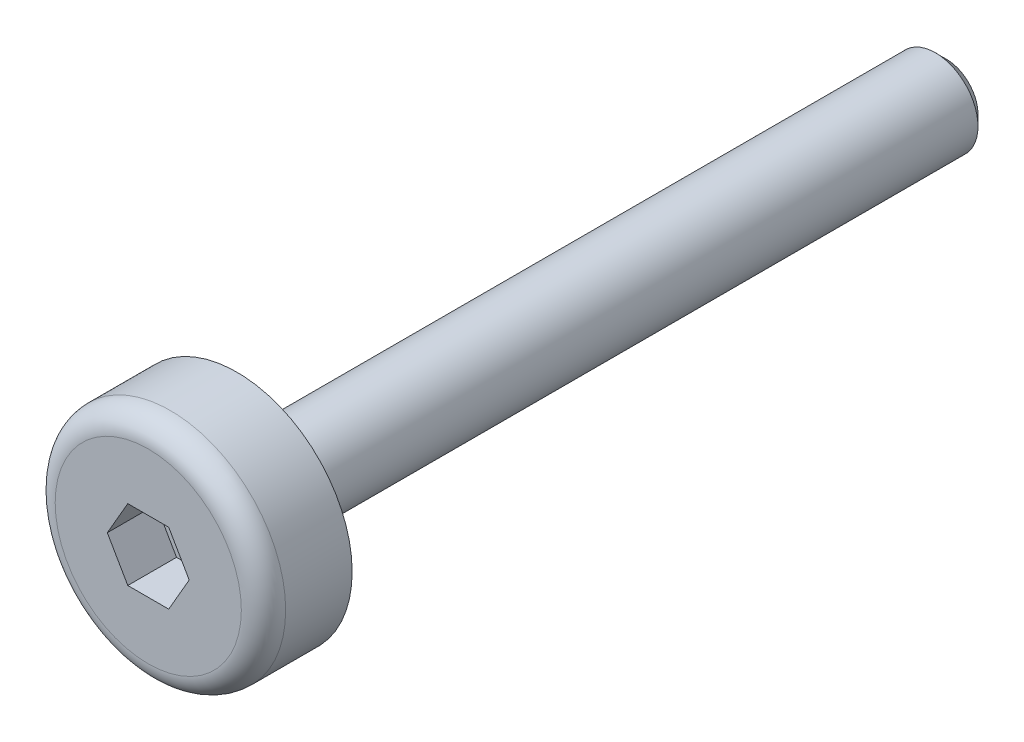
ISO-10303-21;
HEADER;
FILE_DESCRIPTION(('STEP AP214'),'2;1');
FILE_NAME('part.step','',(''),(''),'','','');
FILE_SCHEMA(('AUTOMOTIVE_DESIGN { 1 0 10303 214 1 1 1 1 }'));
ENDSEC;
DATA;
#1=APPLICATION_CONTEXT('core data for automotive mechanical design processes');
#2=APPLICATION_PROTOCOL_DEFINITION('international standard','automotive_design',2000,#1);
#3=PRODUCT_CONTEXT('',#1,'mechanical');
#4=PRODUCT('Part','Part','',(#3));
#5=PRODUCT_RELATED_PRODUCT_CATEGORY('part','',(#4));
#6=PRODUCT_DEFINITION_FORMATION('','',#4);
#7=PRODUCT_DEFINITION_CONTEXT('part definition',#1,'design');
#8=PRODUCT_DEFINITION('design','',#6,#7);
#9=PRODUCT_DEFINITION_SHAPE('','',#8);
#10=(LENGTH_UNIT() NAMED_UNIT(*) SI_UNIT(.MILLI.,.METRE.));
#11=(NAMED_UNIT(*) PLANE_ANGLE_UNIT() SI_UNIT($,.RADIAN.));
#12=(NAMED_UNIT(*) SI_UNIT($,.STERADIAN.) SOLID_ANGLE_UNIT());
#13=UNCERTAINTY_MEASURE_WITH_UNIT(LENGTH_MEASURE(1.E-05),#10,'distance_accuracy_value','');
#14=(GEOMETRIC_REPRESENTATION_CONTEXT(3) GLOBAL_UNCERTAINTY_ASSIGNED_CONTEXT((#13)) GLOBAL_UNIT_ASSIGNED_CONTEXT((#10,
#11,#12)) REPRESENTATION_CONTEXT('',''));
#15=CARTESIAN_POINT('',(0.,0.,0.));
#16=DIRECTION('',(0.,0.,1.));
#17=DIRECTION('',(1.,0.,0.));
#18=AXIS2_PLACEMENT_3D('',#15,#16,#17);
#19=CARTESIAN_POINT('',(0.,0.,-20.));
#20=DIRECTION('',(0.,0.,-1.));
#21=DIRECTION('',(-1.,0.,0.));
#22=AXIS2_PLACEMENT_3D('',#19,#20,#21);
#23=PLANE('',#22);
#24=CARTESIAN_POINT('',(0.,0.,-20.));
#25=DIRECTION('',(0.,0.,-1.));
#26=DIRECTION('',(-1.,0.,0.));
#27=AXIS2_PLACEMENT_3D('',#24,#25,#26);
#28=CIRCLE('',#27,0.900000000000005);
#29=CARTESIAN_POINT('',(-0.900000000000005,0.,-20.));
#30=VERTEX_POINT('',#29);
#31=EDGE_CURVE('E156',#30,#30,#28,.T.);
#32=ORIENTED_EDGE('',*,*,#31,.T.);
#33=EDGE_LOOP('',(#32));
#34=FACE_BOUND('',#33,.T.);
#35=ADVANCED_FACE('F40',(#34),#23,.T.);
#36=CARTESIAN_POINT('',(0.,0.,10.123));
#37=DIRECTION('',(0.,0.,1.));
#38=DIRECTION('',(1.,0.,0.));
#39=AXIS2_PLACEMENT_3D('',#36,#37,#38);
#40=CYLINDRICAL_SURFACE('',#39,1.2);
#41=CARTESIAN_POINT('',(0.,0.,-19.7));
#42=DIRECTION('',(0.,0.,-1.));
#43=DIRECTION('',(-1.,0.,0.));
#44=AXIS2_PLACEMENT_3D('',#41,#42,#43);
#45=CIRCLE('',#44,1.2);
#46=CARTESIAN_POINT('',(-1.2,0.,-19.7));
#47=VERTEX_POINT('',#46);
#48=EDGE_CURVE('E153',#47,#47,#45,.F.);
#49=ORIENTED_EDGE('',*,*,#48,.T.);
#50=EDGE_LOOP('',(#49));
#51=FACE_BOUND('',#50,.T.);
#52=CARTESIAN_POINT('',(0.,0.,0.));
#53=DIRECTION('',(0.,0.,1.));
#54=DIRECTION('',(1.,0.,0.));
#55=AXIS2_PLACEMENT_3D('',#52,#53,#54);
#56=CIRCLE('',#55,1.2);
#57=CARTESIAN_POINT('',(1.2,0.,0.));
#58=VERTEX_POINT('',#57);
#59=EDGE_CURVE('E150',#58,#58,#56,.T.);
#60=ORIENTED_EDGE('',*,*,#59,.F.);
#61=EDGE_LOOP('',(#60));
#62=FACE_BOUND('',#61,.T.);
#63=ADVANCED_FACE('F176',(#51,#62),#40,.T.);
#64=CARTESIAN_POINT('',(1.2,0.,0.));
#65=DIRECTION('',(0.,0.,-1.));
#66=DIRECTION('',(-1.,0.,0.));
#67=AXIS2_PLACEMENT_3D('',#64,#65,#66);
#68=PLANE('',#67);
#69=ORIENTED_EDGE('',*,*,#59,.T.);
#70=EDGE_LOOP('',(#69));
#71=FACE_BOUND('',#70,.T.);
#72=CARTESIAN_POINT('',(0.,0.,0.));
#73=DIRECTION('',(0.,0.,1.));
#74=DIRECTION('',(1.,0.,0.));
#75=AXIS2_PLACEMENT_3D('',#72,#73,#74);
#76=CIRCLE('',#75,3.25);
#77=CARTESIAN_POINT('',(3.25,0.,0.));
#78=VERTEX_POINT('',#77);
#79=EDGE_CURVE('E142',#78,#78,#76,.T.);
#80=ORIENTED_EDGE('',*,*,#79,.F.);
#81=EDGE_LOOP('',(#80));
#82=FACE_BOUND('',#81,.T.);
#83=ADVANCED_FACE('F182',(#71,#82),#68,.T.);
#84=CARTESIAN_POINT('',(0.,0.,10.123));
#85=DIRECTION('',(0.,0.,1.));
#86=DIRECTION('',(1.,0.,0.));
#87=AXIS2_PLACEMENT_3D('',#84,#85,#86);
#88=CYLINDRICAL_SURFACE('',#87,3.25);
#89=CARTESIAN_POINT('',(0.,0.,1.875));
#90=DIRECTION('',(0.,0.,1.));
#91=DIRECTION('',(1.,0.,0.));
#92=AXIS2_PLACEMENT_3D('',#89,#90,#91);
#93=CIRCLE('',#92,3.25);
#94=CARTESIAN_POINT('',(3.25,0.,1.875));
#95=VERTEX_POINT('',#94);
#96=EDGE_CURVE('E11',#95,#95,#93,.F.);
#97=ORIENTED_EDGE('',*,*,#96,.T.);
#98=EDGE_LOOP('',(#97));
#99=FACE_BOUND('',#98,.T.);
#100=ORIENTED_EDGE('',*,*,#79,.T.);
#101=EDGE_LOOP('',(#100));
#102=FACE_BOUND('',#101,.T.);
#103=ADVANCED_FACE('F191',(#99,#102),#88,.T.);
#104=CARTESIAN_POINT('',(3.25,0.,2.5));
#105=DIRECTION('',(0.,0.,1.));
#106=DIRECTION('',(1.,0.,0.));
#107=AXIS2_PLACEMENT_3D('',#104,#105,#106);
#108=PLANE('',#107);
#109=DIRECTION('',(0.499999999999995,0.866025403784441,0.));
#110=VECTOR('',#109,1.);
#111=CARTESIAN_POINT('',(0.577350269189637,-0.999999999999993,2.5));
#112=LINE('',#111,#110);
#113=CARTESIAN_POINT('',(0.577350269189637,-0.999999999999993,2.5));
#114=VERTEX_POINT('',#113);
#115=CARTESIAN_POINT('',(1.15470053837925,0.,2.5));
#116=VERTEX_POINT('',#115);
#117=EDGE_CURVE('E55',#114,#116,#112,.T.);
#118=ORIENTED_EDGE('',*,*,#117,.F.);
#119=DIRECTION('',(1.,0.,0.));
#120=VECTOR('',#119,1.);
#121=CARTESIAN_POINT('',(-0.577350269189617,-1.00000000000001,2.5));
#122=LINE('',#121,#120);
#123=CARTESIAN_POINT('',(-0.577350269189617,-1.00000000000001,2.5));
#124=VERTEX_POINT('',#123);
#125=EDGE_CURVE('E138',#124,#114,#122,.T.);
#126=ORIENTED_EDGE('',*,*,#125,.F.);
#127=DIRECTION('',(0.500000000000007,-0.866025403784434,0.));
#128=VECTOR('',#127,1.);
#129=CARTESIAN_POINT('',(-1.15470053837925,0.,2.5));
#130=LINE('',#129,#128);
#131=CARTESIAN_POINT('',(-1.15470053837925,0.,2.5));
#132=VERTEX_POINT('',#131);
#133=EDGE_CURVE('E136',#132,#124,#130,.T.);
#134=ORIENTED_EDGE('',*,*,#133,.F.);
#135=DIRECTION('',(-0.499999999999995,-0.866025403784442,0.));
#136=VECTOR('',#135,1.);
#137=CARTESIAN_POINT('',(-0.57735026918963,0.999999999999998,2.5));
#138=LINE('',#137,#136);
#139=CARTESIAN_POINT('',(-0.57735026918963,0.999999999999998,2.5));
#140=VERTEX_POINT('',#139);
#141=EDGE_CURVE('E103',#140,#132,#138,.T.);
#142=ORIENTED_EDGE('',*,*,#141,.F.);
#143=DIRECTION('',(-1.,0.,0.));
#144=VECTOR('',#143,1.);
#145=CARTESIAN_POINT('',(0.577350269189624,1.,2.5));
#146=LINE('',#145,#144);
#147=CARTESIAN_POINT('',(0.577350269189624,1.,2.5));
#148=VERTEX_POINT('',#147);
#149=EDGE_CURVE('E132',#148,#140,#146,.T.);
#150=ORIENTED_EDGE('',*,*,#149,.F.);
#151=DIRECTION('',(-0.500000000000001,0.866025403784438,0.));
#152=VECTOR('',#151,1.);
#153=CARTESIAN_POINT('',(1.15470053837925,0.,2.5));
#154=LINE('',#153,#152);
#155=EDGE_CURVE('E129',#116,#148,#154,.T.);
#156=ORIENTED_EDGE('',*,*,#155,.F.);
#157=EDGE_LOOP('',(#118,#126,#134,#142,#150,#156));
#158=FACE_BOUND('',#157,.T.);
#159=CARTESIAN_POINT('',(0.,0.,2.5));
#160=DIRECTION('',(0.,0.,1.));
#161=DIRECTION('',(1.,0.,0.));
#162=AXIS2_PLACEMENT_3D('',#159,#160,#161);
#163=CIRCLE('',#162,2.625);
#164=CARTESIAN_POINT('',(2.625,0.,2.5));
#165=VERTEX_POINT('',#164);
#166=EDGE_CURVE('E48',#165,#165,#163,.T.);
#167=ORIENTED_EDGE('',*,*,#166,.T.);
#168=EDGE_LOOP('',(#167));
#169=FACE_BOUND('',#168,.T.);
#170=ADVANCED_FACE('F161',(#158,#169),#108,.T.);
#171=CARTESIAN_POINT('',(0.,0.,-19.7));
#172=DIRECTION('',(0.,0.,1.));
#173=DIRECTION('',(1.,0.,0.));
#174=AXIS2_PLACEMENT_3D('',#171,#172,#173);
#175=CONICAL_SURFACE('',#174,1.2,0.785398163397443);
#176=ORIENTED_EDGE('',*,*,#31,.F.);
#177=EDGE_LOOP('',(#176));
#178=FACE_BOUND('',#177,.T.);
#179=ORIENTED_EDGE('',*,*,#48,.F.);
#180=EDGE_LOOP('',(#179));
#181=FACE_BOUND('',#180,.T.);
#182=ADVANCED_FACE('F165',(#178,#181),#175,.T.);
#183=CARTESIAN_POINT('',(0.,0.,1.875));
#184=DIRECTION('',(0.,0.,1.));
#185=DIRECTION('',(1.,0.,0.));
#186=AXIS2_PLACEMENT_3D('',#183,#184,#185);
#187=TOROIDAL_SURFACE('',#186,2.625,0.625);
#188=ORIENTED_EDGE('',*,*,#96,.F.);
#189=EDGE_LOOP('',(#188));
#190=FACE_BOUND('',#189,.T.);
#191=ORIENTED_EDGE('',*,*,#166,.F.);
#192=EDGE_LOOP('',(#191));
#193=FACE_BOUND('',#192,.T.);
#194=ADVANCED_FACE('F42',(#190,#193),#187,.T.);
#195=CARTESIAN_POINT('',(0.577350269189637,-0.999999999999993,1.125));
#196=DIRECTION('',(0.866025403784441,-0.499999999999995,0.));
#197=DIRECTION('',(0.499999999999995,0.866025403784441,0.));
#198=AXIS2_PLACEMENT_3D('',#195,#196,#197);
#199=PLANE('',#198);
#200=ORIENTED_EDGE('',*,*,#117,.T.);
#201=DIRECTION('',(0.,0.,1.));
#202=VECTOR('',#201,1.);
#203=CARTESIAN_POINT('',(1.15470053837925,0.,1.125));
#204=LINE('',#203,#202);
#205=CARTESIAN_POINT('',(1.15470053837925,0.,1.125));
#206=VERTEX_POINT('',#205);
#207=EDGE_CURVE('E85',#206,#116,#204,.T.);
#208=ORIENTED_EDGE('',*,*,#207,.F.);
#209=DIRECTION('',(0.499999999999995,0.866025403784441,0.));
#210=VECTOR('',#209,1.);
#211=CARTESIAN_POINT('',(0.577350269189637,-0.999999999999993,1.125));
#212=LINE('',#211,#210);
#213=CARTESIAN_POINT('',(0.577350269189637,-0.999999999999993,1.125));
#214=VERTEX_POINT('',#213);
#215=EDGE_CURVE('E140',#214,#206,#212,.T.);
#216=ORIENTED_EDGE('',*,*,#215,.F.);
#217=DIRECTION('',(0.,0.,1.));
#218=VECTOR('',#217,1.);
#219=CARTESIAN_POINT('',(0.577350269189637,-0.999999999999993,1.125));
#220=LINE('',#219,#218);
#221=EDGE_CURVE('E63',#214,#114,#220,.T.);
#222=ORIENTED_EDGE('',*,*,#221,.T.);
#223=EDGE_LOOP('',(#200,#208,#216,#222));
#224=FACE_BOUND('',#223,.T.);
#225=ADVANCED_FACE('F164',(#224),#199,.F.);
#226=CARTESIAN_POINT('',(-0.577350269189617,-1.00000000000001,1.125));
#227=DIRECTION('',(0.,-1.,0.));
#228=DIRECTION('',(1.,0.,0.));
#229=AXIS2_PLACEMENT_3D('',#226,#227,#228);
#230=PLANE('',#229);
#231=ORIENTED_EDGE('',*,*,#125,.T.);
#232=ORIENTED_EDGE('',*,*,#221,.F.);
#233=DIRECTION('',(1.,0.,0.));
#234=VECTOR('',#233,1.);
#235=CARTESIAN_POINT('',(-0.577350269189617,-1.00000000000001,1.125));
#236=LINE('',#235,#234);
#237=CARTESIAN_POINT('',(-0.577350269189617,-1.00000000000001,1.125));
#238=VERTEX_POINT('',#237);
#239=EDGE_CURVE('E115',#238,#214,#236,.T.);
#240=ORIENTED_EDGE('',*,*,#239,.F.);
#241=DIRECTION('',(0.,0.,1.));
#242=VECTOR('',#241,1.);
#243=CARTESIAN_POINT('',(-0.577350269189617,-1.00000000000001,1.125));
#244=LINE('',#243,#242);
#245=EDGE_CURVE('E107',#238,#124,#244,.T.);
#246=ORIENTED_EDGE('',*,*,#245,.T.);
#247=EDGE_LOOP('',(#231,#232,#240,#246));
#248=FACE_BOUND('',#247,.T.);
#249=ADVANCED_FACE('F171',(#248),#230,.F.);
#250=CARTESIAN_POINT('',(-1.15470053837925,0.,1.125));
#251=DIRECTION('',(-0.866025403784435,-0.500000000000007,0.));
#252=DIRECTION('',(0.500000000000007,-0.866025403784435,0.));
#253=AXIS2_PLACEMENT_3D('',#250,#251,#252);
#254=PLANE('',#253);
#255=ORIENTED_EDGE('',*,*,#133,.T.);
#256=ORIENTED_EDGE('',*,*,#245,.F.);
#257=DIRECTION('',(0.500000000000007,-0.866025403784434,0.));
#258=VECTOR('',#257,1.);
#259=CARTESIAN_POINT('',(-1.15470053837925,0.,1.125));
#260=LINE('',#259,#258);
#261=CARTESIAN_POINT('',(-1.15470053837925,0.,1.125));
#262=VERTEX_POINT('',#261);
#263=EDGE_CURVE('E111',#262,#238,#260,.T.);
#264=ORIENTED_EDGE('',*,*,#263,.F.);
#265=DIRECTION('',(0.,0.,1.));
#266=VECTOR('',#265,1.);
#267=CARTESIAN_POINT('',(-1.15470053837925,0.,1.125));
#268=LINE('',#267,#266);
#269=EDGE_CURVE('E96',#262,#132,#268,.T.);
#270=ORIENTED_EDGE('',*,*,#269,.T.);
#271=EDGE_LOOP('',(#255,#256,#264,#270));
#272=FACE_BOUND('',#271,.T.);
#273=ADVANCED_FACE('F112',(#272),#254,.F.);
#274=CARTESIAN_POINT('',(-0.57735026918963,0.999999999999998,1.125));
#275=DIRECTION('',(-0.866025403784442,0.499999999999995,0.));
#276=DIRECTION('',(-0.499999999999995,-0.866025403784441,0.));
#277=AXIS2_PLACEMENT_3D('',#274,#275,#276);
#278=PLANE('',#277);
#279=ORIENTED_EDGE('',*,*,#141,.T.);
#280=ORIENTED_EDGE('',*,*,#269,.F.);
#281=DIRECTION('',(-0.499999999999995,-0.866025403784442,0.));
#282=VECTOR('',#281,1.);
#283=CARTESIAN_POINT('',(-0.57735026918963,0.999999999999998,1.125));
#284=LINE('',#283,#282);
#285=CARTESIAN_POINT('',(-0.57735026918963,0.999999999999998,1.125));
#286=VERTEX_POINT('',#285);
#287=EDGE_CURVE('E100',#286,#262,#284,.T.);
#288=ORIENTED_EDGE('',*,*,#287,.F.);
#289=DIRECTION('',(0.,0.,1.));
#290=VECTOR('',#289,1.);
#291=CARTESIAN_POINT('',(-0.57735026918963,0.999999999999998,1.125));
#292=LINE('',#291,#290);
#293=EDGE_CURVE('E108',#286,#140,#292,.T.);
#294=ORIENTED_EDGE('',*,*,#293,.T.);
#295=EDGE_LOOP('',(#279,#280,#288,#294));
#296=FACE_BOUND('',#295,.T.);
#297=ADVANCED_FACE('F98',(#296),#278,.F.);
#298=CARTESIAN_POINT('',(0.577350269189624,1.,1.125));
#299=DIRECTION('',(0.,1.,0.));
#300=DIRECTION('',(-1.,0.,0.));
#301=AXIS2_PLACEMENT_3D('',#298,#299,#300);
#302=PLANE('',#301);
#303=ORIENTED_EDGE('',*,*,#149,.T.);
#304=ORIENTED_EDGE('',*,*,#293,.F.);
#305=DIRECTION('',(-1.,0.,0.));
#306=VECTOR('',#305,1.);
#307=CARTESIAN_POINT('',(0.577350269189624,1.,1.125));
#308=LINE('',#307,#306);
#309=CARTESIAN_POINT('',(0.577350269189624,1.,1.125));
#310=VERTEX_POINT('',#309);
#311=EDGE_CURVE('E121',#310,#286,#308,.T.);
#312=ORIENTED_EDGE('',*,*,#311,.F.);
#313=DIRECTION('',(0.,0.,1.));
#314=VECTOR('',#313,1.);
#315=CARTESIAN_POINT('',(0.577350269189624,1.,1.125));
#316=LINE('',#315,#314);
#317=EDGE_CURVE('E145',#310,#148,#316,.T.);
#318=ORIENTED_EDGE('',*,*,#317,.T.);
#319=EDGE_LOOP('',(#303,#304,#312,#318));
#320=FACE_BOUND('',#319,.T.);
#321=ADVANCED_FACE('F202',(#320),#302,.F.);
#322=CARTESIAN_POINT('',(1.15470053837925,0.,1.125));
#323=DIRECTION('',(0.866025403784438,0.500000000000001,0.));
#324=DIRECTION('',(-0.500000000000001,0.866025403784438,0.));
#325=AXIS2_PLACEMENT_3D('',#322,#323,#324);
#326=PLANE('',#325);
#327=ORIENTED_EDGE('',*,*,#155,.T.);
#328=ORIENTED_EDGE('',*,*,#317,.F.);
#329=DIRECTION('',(-0.500000000000001,0.866025403784438,0.));
#330=VECTOR('',#329,1.);
#331=CARTESIAN_POINT('',(1.15470053837925,0.,1.125));
#332=LINE('',#331,#330);
#333=EDGE_CURVE('E123',#206,#310,#332,.T.);
#334=ORIENTED_EDGE('',*,*,#333,.F.);
#335=ORIENTED_EDGE('',*,*,#207,.T.);
#336=EDGE_LOOP('',(#327,#328,#334,#335));
#337=FACE_BOUND('',#336,.T.);
#338=ADVANCED_FACE('F199',(#337),#326,.F.);
#339=CARTESIAN_POINT('',(0.,0.,1.125));
#340=DIRECTION('',(0.,0.,1.));
#341=DIRECTION('',(1.,0.,0.));
#342=AXIS2_PLACEMENT_3D('',#339,#340,#341);
#343=PLANE('',#342);
#344=ORIENTED_EDGE('',*,*,#215,.T.);
#345=ORIENTED_EDGE('',*,*,#333,.T.);
#346=ORIENTED_EDGE('',*,*,#311,.T.);
#347=ORIENTED_EDGE('',*,*,#287,.T.);
#348=ORIENTED_EDGE('',*,*,#263,.T.);
#349=ORIENTED_EDGE('',*,*,#239,.T.);
#350=EDGE_LOOP('',(#344,#345,#346,#347,#348,#349));
#351=FACE_BOUND('',#350,.T.);
#352=ADVANCED_FACE('F118',(#351),#343,.T.);
#353=CLOSED_SHELL('',(#35,#63,#83,#103,#170,#182,#194,#225,#249,#273,#297,#321,#338,#352));
#354=MANIFOLD_SOLID_BREP('B2',#353);
#355=ADVANCED_BREP_SHAPE_REPRESENTATION('',(#18,#354),#14);
#356=SHAPE_DEFINITION_REPRESENTATION(#9,#355);
ENDSEC;
END-ISO-10303-21;
